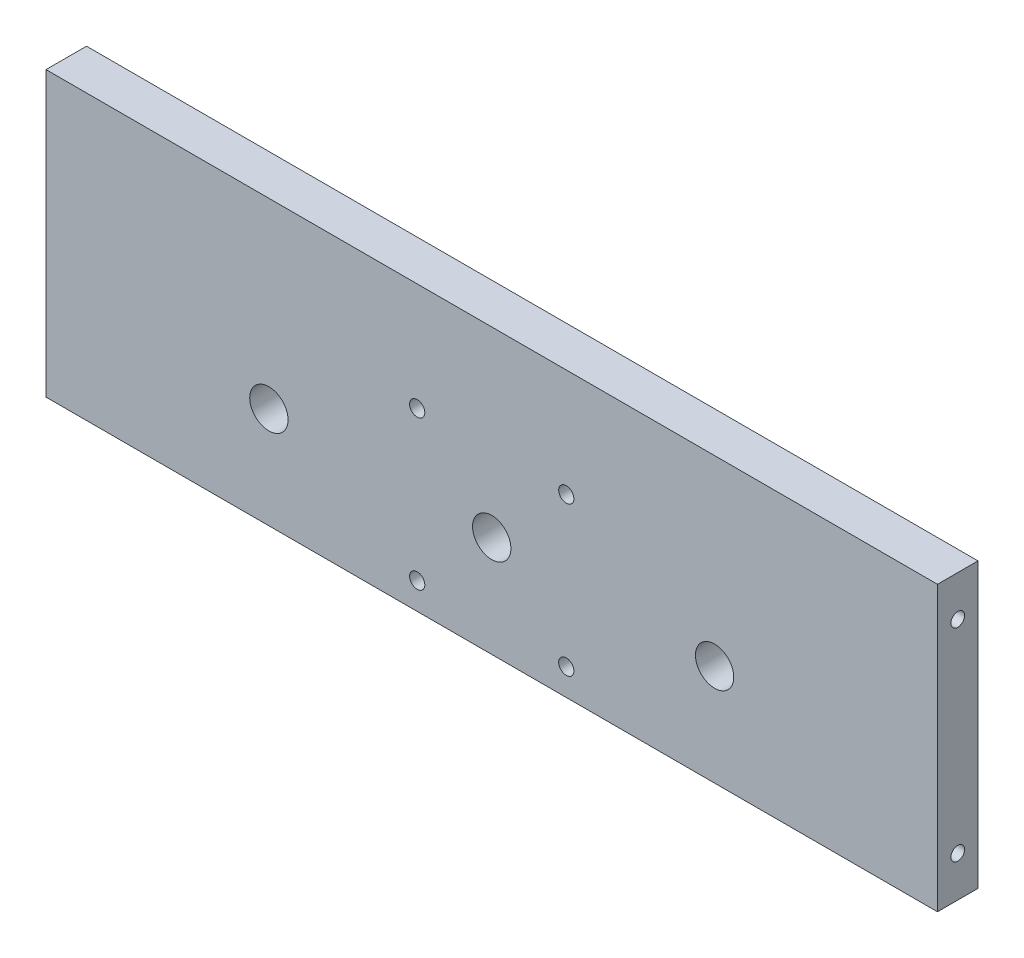
ISO-10303-21;
HEADER;
FILE_DESCRIPTION(('STEP AP214'),'2;1');
FILE_NAME('part.step','',(''),(''),'','','');
FILE_SCHEMA(('AUTOMOTIVE_DESIGN { 1 0 10303 214 1 1 1 1 }'));
ENDSEC;
DATA;
#1=APPLICATION_CONTEXT('core data for automotive mechanical design processes');
#2=APPLICATION_PROTOCOL_DEFINITION('international standard','automotive_design',2000,#1);
#3=PRODUCT_CONTEXT('',#1,'mechanical');
#4=PRODUCT('Part','Part','',(#3));
#5=PRODUCT_RELATED_PRODUCT_CATEGORY('part','',(#4));
#6=PRODUCT_DEFINITION_FORMATION('','',#4);
#7=PRODUCT_DEFINITION_CONTEXT('part definition',#1,'design');
#8=PRODUCT_DEFINITION('design','',#6,#7);
#9=PRODUCT_DEFINITION_SHAPE('','',#8);
#10=(LENGTH_UNIT() NAMED_UNIT(*) SI_UNIT(.MILLI.,.METRE.));
#11=(NAMED_UNIT(*) PLANE_ANGLE_UNIT() SI_UNIT($,.RADIAN.));
#12=(NAMED_UNIT(*) SI_UNIT($,.STERADIAN.) SOLID_ANGLE_UNIT());
#13=UNCERTAINTY_MEASURE_WITH_UNIT(LENGTH_MEASURE(1.E-05),#10,'distance_accuracy_value','');
#14=(GEOMETRIC_REPRESENTATION_CONTEXT(3) GLOBAL_UNCERTAINTY_ASSIGNED_CONTEXT((#13)) GLOBAL_UNIT_ASSIGNED_CONTEXT((#10,
#11,#12)) REPRESENTATION_CONTEXT('',''));
#15=CARTESIAN_POINT('',(0.,0.,0.));
#16=DIRECTION('',(0.,0.,1.));
#17=DIRECTION('',(1.,0.,0.));
#18=AXIS2_PLACEMENT_3D('',#15,#16,#17);
#19=CARTESIAN_POINT('',(0.,88.9,12.7));
#20=DIRECTION('',(0.,0.,-1.));
#21=DIRECTION('',(-1.,0.,0.));
#22=AXIS2_PLACEMENT_3D('',#19,#20,#21);
#23=PLANE('',#22);
#24=CARTESIAN_POINT('',(116.33835,55.11165,12.7));
#25=DIRECTION('',(0.,0.,1.));
#26=DIRECTION('',(1.,0.,0.));
#27=AXIS2_PLACEMENT_3D('',#24,#25,#26);
#28=CIRCLE('',#27,2.38124999999995);
#29=CARTESIAN_POINT('',(118.7196,55.11165,12.7));
#30=VERTEX_POINT('',#29);
#31=EDGE_CURVE('E166',#30,#30,#28,.T.);
#32=ORIENTED_EDGE('',*,*,#31,.F.);
#33=EDGE_LOOP('',(#32));
#34=FACE_BOUND('',#33,.T.);
#35=CARTESIAN_POINT('',(116.33835,8.38834999999998,12.7));
#36=DIRECTION('',(0.,0.,1.));
#37=DIRECTION('',(1.,0.,0.));
#38=AXIS2_PLACEMENT_3D('',#35,#36,#37);
#39=CIRCLE('',#38,2.38124999999995);
#40=CARTESIAN_POINT('',(118.7196,8.38834999999998,12.7));
#41=VERTEX_POINT('',#40);
#42=EDGE_CURVE('E151',#41,#41,#39,.T.);
#43=ORIENTED_EDGE('',*,*,#42,.F.);
#44=EDGE_LOOP('',(#43));
#45=FACE_BOUND('',#44,.T.);
#46=CARTESIAN_POINT('',(69.85,31.75,12.7));
#47=DIRECTION('',(0.,0.,-1.));
#48=DIRECTION('',(-1.,0.,0.));
#49=AXIS2_PLACEMENT_3D('',#46,#47,#48);
#50=CIRCLE('',#49,6.0071);
#51=CARTESIAN_POINT('',(63.8429,31.75,12.7));
#52=VERTEX_POINT('',#51);
#53=EDGE_CURVE('E145',#52,#52,#50,.T.);
#54=ORIENTED_EDGE('',*,*,#53,.T.);
#55=EDGE_LOOP('',(#54));
#56=FACE_BOUND('',#55,.T.);
#57=CARTESIAN_POINT('',(139.7,31.75,12.7));
#58=DIRECTION('',(0.,0.,-1.));
#59=DIRECTION('',(-1.,0.,0.));
#60=AXIS2_PLACEMENT_3D('',#57,#58,#59);
#61=CIRCLE('',#60,6.00709999999998);
#62=CARTESIAN_POINT('',(133.6929,31.75,12.7));
#63=VERTEX_POINT('',#62);
#64=EDGE_CURVE('E139',#63,#63,#61,.T.);
#65=ORIENTED_EDGE('',*,*,#64,.T.);
#66=EDGE_LOOP('',(#65));
#67=FACE_BOUND('',#66,.T.);
#68=CARTESIAN_POINT('',(209.55,31.75,12.7));
#69=DIRECTION('',(0.,0.,-1.));
#70=DIRECTION('',(-1.,0.,0.));
#71=AXIS2_PLACEMENT_3D('',#68,#69,#70);
#72=CIRCLE('',#71,6.00709999999998);
#73=CARTESIAN_POINT('',(203.5429,31.75,12.7));
#74=VERTEX_POINT('',#73);
#75=EDGE_CURVE('E133',#74,#74,#72,.T.);
#76=ORIENTED_EDGE('',*,*,#75,.T.);
#77=EDGE_LOOP('',(#76));
#78=FACE_BOUND('',#77,.T.);
#79=DIRECTION('',(0.,-1.,0.));
#80=VECTOR('',#79,1.);
#81=CARTESIAN_POINT('',(0.,0.,12.7));
#82=LINE('',#81,#80);
#83=CARTESIAN_POINT('',(0.,88.9,12.7));
#84=VERTEX_POINT('',#83);
#85=CARTESIAN_POINT('',(0.,0.,12.7));
#86=VERTEX_POINT('',#85);
#87=EDGE_CURVE('E85',#84,#86,#82,.T.);
#88=ORIENTED_EDGE('',*,*,#87,.T.);
#89=DIRECTION('',(1.,0.,0.));
#90=VECTOR('',#89,1.);
#91=CARTESIAN_POINT('',(0.,0.,12.7));
#92=LINE('',#91,#90);
#93=CARTESIAN_POINT('',(279.4,0.,12.7));
#94=VERTEX_POINT('',#93);
#95=EDGE_CURVE('E80',#86,#94,#92,.T.);
#96=ORIENTED_EDGE('',*,*,#95,.T.);
#97=DIRECTION('',(0.,1.,0.));
#98=VECTOR('',#97,1.);
#99=CARTESIAN_POINT('',(279.4,0.,12.7));
#100=LINE('',#99,#98);
#101=CARTESIAN_POINT('',(279.4,88.9,12.7));
#102=VERTEX_POINT('',#101);
#103=EDGE_CURVE('E83',#94,#102,#100,.T.);
#104=ORIENTED_EDGE('',*,*,#103,.T.);
#105=DIRECTION('',(-1.,0.,0.));
#106=VECTOR('',#105,1.);
#107=CARTESIAN_POINT('',(0.,88.9,12.7));
#108=LINE('',#107,#106);
#109=EDGE_CURVE('E50',#102,#84,#108,.T.);
#110=ORIENTED_EDGE('',*,*,#109,.T.);
#111=EDGE_LOOP('',(#88,#96,#104,#110));
#112=FACE_BOUND('',#111,.T.);
#113=CARTESIAN_POINT('',(163.06165,8.38834999999999,12.7));
#114=DIRECTION('',(0.,0.,1.));
#115=DIRECTION('',(1.,0.,0.));
#116=AXIS2_PLACEMENT_3D('',#113,#114,#115);
#117=CIRCLE('',#116,2.38125);
#118=CARTESIAN_POINT('',(165.4429,8.38834999999999,12.7));
#119=VERTEX_POINT('',#118);
#120=EDGE_CURVE('E160',#119,#119,#117,.T.);
#121=ORIENTED_EDGE('',*,*,#120,.F.);
#122=EDGE_LOOP('',(#121));
#123=FACE_BOUND('',#122,.T.);
#124=CARTESIAN_POINT('',(163.06165,55.11165,12.7));
#125=DIRECTION('',(0.,0.,1.));
#126=DIRECTION('',(1.,0.,0.));
#127=AXIS2_PLACEMENT_3D('',#124,#125,#126);
#128=CIRCLE('',#127,2.38125);
#129=CARTESIAN_POINT('',(165.4429,55.11165,12.7));
#130=VERTEX_POINT('',#129);
#131=EDGE_CURVE('E172',#130,#130,#128,.T.);
#132=ORIENTED_EDGE('',*,*,#131,.F.);
#133=EDGE_LOOP('',(#132));
#134=FACE_BOUND('',#133,.T.);
#135=ADVANCED_FACE('F33',(#34,#45,#56,#67,#78,#112,#123,#134),#23,.F.);
#136=CARTESIAN_POINT('',(0.,88.9,0.));
#137=DIRECTION('',(0.,0.,-1.));
#138=DIRECTION('',(-1.,0.,0.));
#139=AXIS2_PLACEMENT_3D('',#136,#137,#138);
#140=PLANE('',#139);
#141=CARTESIAN_POINT('',(116.33835,55.11165,0.));
#142=DIRECTION('',(0.,0.,1.));
#143=DIRECTION('',(1.,0.,0.));
#144=AXIS2_PLACEMENT_3D('',#141,#142,#143);
#145=CIRCLE('',#144,2.38124999999995);
#146=CARTESIAN_POINT('',(118.7196,55.11165,0.));
#147=VERTEX_POINT('',#146);
#148=EDGE_CURVE('E163',#147,#147,#145,.T.);
#149=ORIENTED_EDGE('',*,*,#148,.T.);
#150=EDGE_LOOP('',(#149));
#151=FACE_BOUND('',#150,.T.);
#152=CARTESIAN_POINT('',(116.33835,8.38834999999998,0.));
#153=DIRECTION('',(0.,0.,1.));
#154=DIRECTION('',(1.,0.,0.));
#155=AXIS2_PLACEMENT_3D('',#152,#153,#154);
#156=CIRCLE('',#155,2.38124999999995);
#157=CARTESIAN_POINT('',(118.7196,8.38834999999998,0.));
#158=VERTEX_POINT('',#157);
#159=EDGE_CURVE('E154',#158,#158,#156,.T.);
#160=ORIENTED_EDGE('',*,*,#159,.T.);
#161=EDGE_LOOP('',(#160));
#162=FACE_BOUND('',#161,.T.);
#163=CARTESIAN_POINT('',(69.85,31.75,0.));
#164=DIRECTION('',(0.,0.,-1.));
#165=DIRECTION('',(-1.,0.,0.));
#166=AXIS2_PLACEMENT_3D('',#163,#164,#165);
#167=CIRCLE('',#166,6.0071);
#168=CARTESIAN_POINT('',(63.8429,31.75,0.));
#169=VERTEX_POINT('',#168);
#170=EDGE_CURVE('E148',#169,#169,#167,.T.);
#171=ORIENTED_EDGE('',*,*,#170,.F.);
#172=EDGE_LOOP('',(#171));
#173=FACE_BOUND('',#172,.T.);
#174=CARTESIAN_POINT('',(139.7,31.75,0.));
#175=DIRECTION('',(0.,0.,-1.));
#176=DIRECTION('',(-1.,0.,0.));
#177=AXIS2_PLACEMENT_3D('',#174,#175,#176);
#178=CIRCLE('',#177,6.00709999999998);
#179=CARTESIAN_POINT('',(133.6929,31.75,0.));
#180=VERTEX_POINT('',#179);
#181=EDGE_CURVE('E142',#180,#180,#178,.T.);
#182=ORIENTED_EDGE('',*,*,#181,.F.);
#183=EDGE_LOOP('',(#182));
#184=FACE_BOUND('',#183,.T.);
#185=CARTESIAN_POINT('',(209.55,31.75,0.));
#186=DIRECTION('',(0.,0.,-1.));
#187=DIRECTION('',(-1.,0.,0.));
#188=AXIS2_PLACEMENT_3D('',#185,#186,#187);
#189=CIRCLE('',#188,6.00709999999998);
#190=CARTESIAN_POINT('',(203.5429,31.75,0.));
#191=VERTEX_POINT('',#190);
#192=EDGE_CURVE('E136',#191,#191,#189,.T.);
#193=ORIENTED_EDGE('',*,*,#192,.F.);
#194=EDGE_LOOP('',(#193));
#195=FACE_BOUND('',#194,.T.);
#196=DIRECTION('',(0.,-1.,0.));
#197=VECTOR('',#196,1.);
#198=CARTESIAN_POINT('',(0.,0.,0.));
#199=LINE('',#198,#197);
#200=CARTESIAN_POINT('',(0.,88.9,0.));
#201=VERTEX_POINT('',#200);
#202=CARTESIAN_POINT('',(0.,0.,0.));
#203=VERTEX_POINT('',#202);
#204=EDGE_CURVE('E97',#201,#203,#199,.T.);
#205=ORIENTED_EDGE('',*,*,#204,.F.);
#206=DIRECTION('',(-1.,0.,0.));
#207=VECTOR('',#206,1.);
#208=CARTESIAN_POINT('',(0.,88.9,0.));
#209=LINE('',#208,#207);
#210=CARTESIAN_POINT('',(279.4,88.9,0.));
#211=VERTEX_POINT('',#210);
#212=EDGE_CURVE('E73',#211,#201,#209,.T.);
#213=ORIENTED_EDGE('',*,*,#212,.F.);
#214=DIRECTION('',(0.,1.,0.));
#215=VECTOR('',#214,1.);
#216=CARTESIAN_POINT('',(279.4,0.,0.));
#217=LINE('',#216,#215);
#218=CARTESIAN_POINT('',(279.4,0.,0.));
#219=VERTEX_POINT('',#218);
#220=EDGE_CURVE('E67',#219,#211,#217,.T.);
#221=ORIENTED_EDGE('',*,*,#220,.F.);
#222=DIRECTION('',(1.,0.,0.));
#223=VECTOR('',#222,1.);
#224=CARTESIAN_POINT('',(0.,0.,0.));
#225=LINE('',#224,#223);
#226=EDGE_CURVE('E89',#203,#219,#225,.T.);
#227=ORIENTED_EDGE('',*,*,#226,.F.);
#228=EDGE_LOOP('',(#205,#213,#221,#227));
#229=FACE_BOUND('',#228,.T.);
#230=CARTESIAN_POINT('',(163.06165,8.38834999999999,0.));
#231=DIRECTION('',(0.,0.,1.));
#232=DIRECTION('',(1.,0.,0.));
#233=AXIS2_PLACEMENT_3D('',#230,#231,#232);
#234=CIRCLE('',#233,2.38125);
#235=CARTESIAN_POINT('',(165.4429,8.38834999999999,0.));
#236=VERTEX_POINT('',#235);
#237=EDGE_CURVE('E157',#236,#236,#234,.T.);
#238=ORIENTED_EDGE('',*,*,#237,.T.);
#239=EDGE_LOOP('',(#238));
#240=FACE_BOUND('',#239,.T.);
#241=CARTESIAN_POINT('',(163.06165,55.11165,0.));
#242=DIRECTION('',(0.,0.,1.));
#243=DIRECTION('',(1.,0.,0.));
#244=AXIS2_PLACEMENT_3D('',#241,#242,#243);
#245=CIRCLE('',#244,2.38125);
#246=CARTESIAN_POINT('',(165.4429,55.11165,0.));
#247=VERTEX_POINT('',#246);
#248=EDGE_CURVE('E169',#247,#247,#245,.T.);
#249=ORIENTED_EDGE('',*,*,#248,.T.);
#250=EDGE_LOOP('',(#249));
#251=FACE_BOUND('',#250,.T.);
#252=ADVANCED_FACE('F108',(#151,#162,#173,#184,#195,#229,#240,#251),#140,.T.);
#253=CARTESIAN_POINT('',(0.,0.,12.7));
#254=DIRECTION('',(1.,0.,0.));
#255=DIRECTION('',(0.,0.,-1.));
#256=AXIS2_PLACEMENT_3D('',#253,#254,#255);
#257=PLANE('',#256);
#258=CARTESIAN_POINT('',(0.,12.7,6.35));
#259=DIRECTION('',(-1.,0.,0.));
#260=DIRECTION('',(0.,0.,1.));
#261=AXIS2_PLACEMENT_3D('',#258,#259,#260);
#262=CIRCLE('',#261,2.1463);
#263=CARTESIAN_POINT('',(0.,12.7,8.4963));
#264=VERTEX_POINT('',#263);
#265=EDGE_CURVE('E130',#264,#264,#262,.T.);
#266=ORIENTED_EDGE('',*,*,#265,.F.);
#267=EDGE_LOOP('',(#266));
#268=FACE_BOUND('',#267,.T.);
#269=CARTESIAN_POINT('',(0.,76.2,6.35));
#270=DIRECTION('',(-1.,0.,0.));
#271=DIRECTION('',(0.,0.,1.));
#272=AXIS2_PLACEMENT_3D('',#269,#270,#271);
#273=CIRCLE('',#272,2.1463);
#274=CARTESIAN_POINT('',(0.,76.2,8.4963));
#275=VERTEX_POINT('',#274);
#276=EDGE_CURVE('E124',#275,#275,#273,.T.);
#277=ORIENTED_EDGE('',*,*,#276,.F.);
#278=EDGE_LOOP('',(#277));
#279=FACE_BOUND('',#278,.T.);
#280=ORIENTED_EDGE('',*,*,#204,.T.);
#281=DIRECTION('',(0.,0.,-1.));
#282=VECTOR('',#281,1.);
#283=CARTESIAN_POINT('',(0.,0.,12.7));
#284=LINE('',#283,#282);
#285=EDGE_CURVE('E11',#86,#203,#284,.T.);
#286=ORIENTED_EDGE('',*,*,#285,.F.);
#287=ORIENTED_EDGE('',*,*,#87,.F.);
#288=DIRECTION('',(0.,0.,-1.));
#289=VECTOR('',#288,1.);
#290=CARTESIAN_POINT('',(0.,88.9,12.7));
#291=LINE('',#290,#289);
#292=EDGE_CURVE('E93',#84,#201,#291,.T.);
#293=ORIENTED_EDGE('',*,*,#292,.T.);
#294=EDGE_LOOP('',(#280,#286,#287,#293));
#295=FACE_BOUND('',#294,.T.);
#296=ADVANCED_FACE('F35',(#268,#279,#295),#257,.F.);
#297=CARTESIAN_POINT('',(0.,0.,12.7));
#298=DIRECTION('',(0.,1.,0.));
#299=DIRECTION('',(0.,0.,1.));
#300=AXIS2_PLACEMENT_3D('',#297,#298,#299);
#301=PLANE('',#300);
#302=ORIENTED_EDGE('',*,*,#226,.T.);
#303=DIRECTION('',(0.,0.,-1.));
#304=VECTOR('',#303,1.);
#305=CARTESIAN_POINT('',(279.4,0.,12.7));
#306=LINE('',#305,#304);
#307=EDGE_CURVE('E42',#94,#219,#306,.T.);
#308=ORIENTED_EDGE('',*,*,#307,.F.);
#309=ORIENTED_EDGE('',*,*,#95,.F.);
#310=ORIENTED_EDGE('',*,*,#285,.T.);
#311=EDGE_LOOP('',(#302,#308,#309,#310));
#312=FACE_BOUND('',#311,.T.);
#313=ADVANCED_FACE('F88',(#312),#301,.F.);
#314=CARTESIAN_POINT('',(279.4,0.,12.7));
#315=DIRECTION('',(-1.,0.,0.));
#316=DIRECTION('',(0.,0.,1.));
#317=AXIS2_PLACEMENT_3D('',#314,#315,#316);
#318=PLANE('',#317);
#319=CARTESIAN_POINT('',(279.4,12.7,6.35));
#320=DIRECTION('',(1.,0.,0.));
#321=DIRECTION('',(0.,0.,-1.));
#322=AXIS2_PLACEMENT_3D('',#319,#320,#321);
#323=CIRCLE('',#322,2.1463);
#324=CARTESIAN_POINT('',(279.4,12.7,4.2037));
#325=VERTEX_POINT('',#324);
#326=EDGE_CURVE('E118',#325,#325,#323,.T.);
#327=ORIENTED_EDGE('',*,*,#326,.F.);
#328=EDGE_LOOP('',(#327));
#329=FACE_BOUND('',#328,.T.);
#330=CARTESIAN_POINT('',(279.4,76.2,6.35));
#331=DIRECTION('',(1.,0.,0.));
#332=DIRECTION('',(0.,0.,-1.));
#333=AXIS2_PLACEMENT_3D('',#330,#331,#332);
#334=CIRCLE('',#333,2.1463);
#335=CARTESIAN_POINT('',(279.4,76.2,4.2037));
#336=VERTEX_POINT('',#335);
#337=EDGE_CURVE('E112',#336,#336,#334,.T.);
#338=ORIENTED_EDGE('',*,*,#337,.F.);
#339=EDGE_LOOP('',(#338));
#340=FACE_BOUND('',#339,.T.);
#341=ORIENTED_EDGE('',*,*,#220,.T.);
#342=DIRECTION('',(0.,0.,-1.));
#343=VECTOR('',#342,1.);
#344=CARTESIAN_POINT('',(279.4,88.9,12.7));
#345=LINE('',#344,#343);
#346=EDGE_CURVE('E90',#102,#211,#345,.T.);
#347=ORIENTED_EDGE('',*,*,#346,.F.);
#348=ORIENTED_EDGE('',*,*,#103,.F.);
#349=ORIENTED_EDGE('',*,*,#307,.T.);
#350=EDGE_LOOP('',(#341,#347,#348,#349));
#351=FACE_BOUND('',#350,.T.);
#352=ADVANCED_FACE('F91',(#329,#340,#351),#318,.F.);
#353=CARTESIAN_POINT('',(0.,88.9,12.7));
#354=DIRECTION('',(0.,-1.,0.));
#355=DIRECTION('',(0.,0.,-1.));
#356=AXIS2_PLACEMENT_3D('',#353,#354,#355);
#357=PLANE('',#356);
#358=ORIENTED_EDGE('',*,*,#212,.T.);
#359=ORIENTED_EDGE('',*,*,#292,.F.);
#360=ORIENTED_EDGE('',*,*,#109,.F.);
#361=ORIENTED_EDGE('',*,*,#346,.T.);
#362=EDGE_LOOP('',(#358,#359,#360,#361));
#363=FACE_BOUND('',#362,.T.);
#364=ADVANCED_FACE('F105',(#363),#357,.F.);
#365=CARTESIAN_POINT('',(241.3,76.2,6.35));
#366=DIRECTION('',(1.,0.,0.));
#367=DIRECTION('',(0.,0.,-1.));
#368=AXIS2_PLACEMENT_3D('',#365,#366,#367);
#369=CYLINDRICAL_SURFACE('',#368,2.1463);
#370=CARTESIAN_POINT('',(241.3,76.2,6.35));
#371=DIRECTION('',(1.,0.,0.));
#372=DIRECTION('',(0.,0.,-1.));
#373=AXIS2_PLACEMENT_3D('',#370,#371,#372);
#374=CIRCLE('',#373,2.1463);
#375=CARTESIAN_POINT('',(241.3,76.2,4.2037));
#376=VERTEX_POINT('',#375);
#377=EDGE_CURVE('E100',#376,#376,#374,.T.);
#378=CARTESIAN_POINT('',(241.3,76.2,4.2037));
#379=CARTESIAN_POINT('',(241.696875,76.2,4.2037));
#380=CARTESIAN_POINT('',(242.09375,76.2,4.2037));
#381=CARTESIAN_POINT('',(242.8875,76.2,4.2037));
#382=CARTESIAN_POINT('',(243.284375,76.2,4.2037));
#383=CARTESIAN_POINT('',(244.078125,76.2,4.2037));
#384=CARTESIAN_POINT('',(244.475,76.2,4.2037));
#385=CARTESIAN_POINT('',(245.26875,76.2,4.2037));
#386=CARTESIAN_POINT('',(245.665625,76.2,4.2037));
#387=CARTESIAN_POINT('',(246.459375,76.2,4.2037));
#388=CARTESIAN_POINT('',(246.85625,76.2,4.2037));
#389=CARTESIAN_POINT('',(247.65,76.2,4.2037));
#390=CARTESIAN_POINT('',(248.046875,76.2,4.2037));
#391=CARTESIAN_POINT('',(248.840625,76.2,4.2037));
#392=CARTESIAN_POINT('',(249.2375,76.2,4.2037));
#393=CARTESIAN_POINT('',(250.03125,76.2,4.2037));
#394=CARTESIAN_POINT('',(250.428125,76.2,4.2037));
#395=CARTESIAN_POINT('',(251.221875,76.2,4.2037));
#396=CARTESIAN_POINT('',(251.61875,76.2,4.2037));
#397=CARTESIAN_POINT('',(252.4125,76.2,4.2037));
#398=CARTESIAN_POINT('',(252.809375,76.2,4.2037));
#399=CARTESIAN_POINT('',(253.603125,76.2,4.2037));
#400=CARTESIAN_POINT('',(254.,76.2,4.2037));
#401=CARTESIAN_POINT('',(254.79375,76.2,4.2037));
#402=CARTESIAN_POINT('',(255.190625,76.2,4.2037));
#403=CARTESIAN_POINT('',(255.984375,76.2,4.2037));
#404=CARTESIAN_POINT('',(256.38125,76.2,4.2037));
#405=CARTESIAN_POINT('',(257.175,76.2,4.2037));
#406=CARTESIAN_POINT('',(257.571875,76.2,4.2037));
#407=CARTESIAN_POINT('',(258.365625,76.2,4.2037));
#408=CARTESIAN_POINT('',(258.7625,76.2,4.2037));
#409=CARTESIAN_POINT('',(259.55625,76.2,4.2037));
#410=CARTESIAN_POINT('',(259.953125,76.2,4.2037));
#411=CARTESIAN_POINT('',(260.746875,76.2,4.2037));
#412=CARTESIAN_POINT('',(261.14375,76.2,4.2037));
#413=CARTESIAN_POINT('',(261.9375,76.2,4.2037));
#414=CARTESIAN_POINT('',(262.334375,76.2,4.2037));
#415=CARTESIAN_POINT('',(263.128125,76.2,4.2037));
#416=CARTESIAN_POINT('',(263.525,76.2,4.2037));
#417=CARTESIAN_POINT('',(264.31875,76.2,4.2037));
#418=CARTESIAN_POINT('',(264.715625,76.2,4.2037));
#419=CARTESIAN_POINT('',(265.509375,76.2,4.2037));
#420=CARTESIAN_POINT('',(265.90625,76.2,4.2037));
#421=CARTESIAN_POINT('',(266.7,76.2,4.2037));
#422=CARTESIAN_POINT('',(267.096875,76.2,4.2037));
#423=CARTESIAN_POINT('',(267.890625,76.2,4.2037));
#424=CARTESIAN_POINT('',(268.2875,76.2,4.2037));
#425=CARTESIAN_POINT('',(269.08125,76.2,4.2037));
#426=CARTESIAN_POINT('',(269.478125,76.2,4.2037));
#427=CARTESIAN_POINT('',(270.271875,76.2,4.2037));
#428=CARTESIAN_POINT('',(270.66875,76.2,4.2037));
#429=CARTESIAN_POINT('',(271.4625,76.2,4.2037));
#430=CARTESIAN_POINT('',(271.859375,76.2,4.2037));
#431=CARTESIAN_POINT('',(272.653125,76.2,4.2037));
#432=CARTESIAN_POINT('',(273.05,76.2,4.2037));
#433=CARTESIAN_POINT('',(273.84375,76.2,4.2037));
#434=CARTESIAN_POINT('',(274.240625,76.2,4.2037));
#435=CARTESIAN_POINT('',(275.034375,76.2,4.2037));
#436=CARTESIAN_POINT('',(275.43125,76.2,4.2037));
#437=CARTESIAN_POINT('',(276.225,76.2,4.2037));
#438=CARTESIAN_POINT('',(276.621875,76.2,4.2037));
#439=CARTESIAN_POINT('',(277.415625,76.2,4.2037));
#440=CARTESIAN_POINT('',(277.8125,76.2,4.2037));
#441=CARTESIAN_POINT('',(278.60625,76.2,4.2037));
#442=CARTESIAN_POINT('',(279.003125,76.2,4.2037));
#443=CARTESIAN_POINT('',(279.4,76.2,4.2037));
#444=B_SPLINE_CURVE_WITH_KNOTS('',3,(#378,#379,#380,#381,#382,#383,#384,#385,#386,#387,#388,
#389,#390,#391,#392,#393,#394,#395,#396,#397,#398,#399,#400,#401,#402,#403,#404,#405,#406,#407,
#408,#409,#410,#411,#412,#413,#414,#415,#416,#417,#418,#419,#420,#421,#422,#423,#424,#425,#426,
#427,#428,#429,#430,#431,#432,#433,#434,#435,#436,#437,#438,#439,#440,#441,#442,#443),
.UNSPECIFIED.,.F.,.F.,(4,2,2,2,2,2,2,2,2,2,2,2,2,2,2,2,2,2,2,2,2,2,2,2,2,2,2,2,2,2,2,2,4),(0.,
1.190625,2.38125,3.571875,4.7625,5.953125,7.14375,8.334375,9.52500000000001,10.715625,11.90625,
13.096875,14.2875,15.478125,16.66875,17.859375,19.05,20.240625,21.43125,22.621875,23.8125,
25.003125,26.19375,27.384375,28.575,29.765625,30.95625,32.146875,33.3375,34.528125,35.71875,
36.909375,38.1),.UNSPECIFIED.);
#445=EDGE_CURVE('BSEAM202',#376,#336,#444,.T.);
#446=ORIENTED_EDGE('',*,*,#377,.F.);
#447=ORIENTED_EDGE('',*,*,#337,.T.);
#448=ORIENTED_EDGE('',*,*,#445,.T.);
#449=ORIENTED_EDGE('',*,*,#445,.F.);
#450=EDGE_LOOP('',(#446,#448,#447,#449));
#451=FACE_BOUND('',#450,.T.);
#452=ADVANCED_FACE('F202',(#451),#369,.F.);
#453=CARTESIAN_POINT('',(241.3,76.2,6.35));
#454=DIRECTION('',(1.,0.,0.));
#455=DIRECTION('',(0.,0.,-1.));
#456=AXIS2_PLACEMENT_3D('',#453,#454,#455);
#457=PLANE('',#456);
#458=ORIENTED_EDGE('',*,*,#377,.T.);
#459=EDGE_LOOP('',(#458));
#460=FACE_BOUND('',#459,.T.);
#461=ADVANCED_FACE('F240',(#460),#457,.T.);
#462=CARTESIAN_POINT('',(241.3,12.7,6.35));
#463=DIRECTION('',(1.,0.,0.));
#464=DIRECTION('',(0.,0.,-1.));
#465=AXIS2_PLACEMENT_3D('',#462,#463,#464);
#466=CYLINDRICAL_SURFACE('',#465,2.1463);
#467=CARTESIAN_POINT('',(241.3,12.7,6.35));
#468=DIRECTION('',(1.,0.,0.));
#469=DIRECTION('',(0.,0.,-1.));
#470=AXIS2_PLACEMENT_3D('',#467,#468,#469);
#471=CIRCLE('',#470,2.1463);
#472=CARTESIAN_POINT('',(241.3,12.7,4.2037));
#473=VERTEX_POINT('',#472);
#474=EDGE_CURVE('E115',#473,#473,#471,.T.);
#475=CARTESIAN_POINT('',(241.3,12.7,4.2037));
#476=CARTESIAN_POINT('',(241.696875,12.7,4.2037));
#477=CARTESIAN_POINT('',(242.09375,12.7,4.2037));
#478=CARTESIAN_POINT('',(242.8875,12.7,4.2037));
#479=CARTESIAN_POINT('',(243.284375,12.7,4.2037));
#480=CARTESIAN_POINT('',(244.078125,12.7,4.2037));
#481=CARTESIAN_POINT('',(244.475,12.7,4.2037));
#482=CARTESIAN_POINT('',(245.26875,12.7,4.2037));
#483=CARTESIAN_POINT('',(245.665625,12.7,4.2037));
#484=CARTESIAN_POINT('',(246.459375,12.7,4.2037));
#485=CARTESIAN_POINT('',(246.85625,12.7,4.2037));
#486=CARTESIAN_POINT('',(247.65,12.7,4.2037));
#487=CARTESIAN_POINT('',(248.046875,12.7,4.2037));
#488=CARTESIAN_POINT('',(248.840625,12.7,4.2037));
#489=CARTESIAN_POINT('',(249.2375,12.7,4.2037));
#490=CARTESIAN_POINT('',(250.03125,12.7,4.2037));
#491=CARTESIAN_POINT('',(250.428125,12.7,4.2037));
#492=CARTESIAN_POINT('',(251.221875,12.7,4.2037));
#493=CARTESIAN_POINT('',(251.61875,12.7,4.2037));
#494=CARTESIAN_POINT('',(252.4125,12.7,4.2037));
#495=CARTESIAN_POINT('',(252.809375,12.7,4.2037));
#496=CARTESIAN_POINT('',(253.603125,12.7,4.2037));
#497=CARTESIAN_POINT('',(254.,12.7,4.2037));
#498=CARTESIAN_POINT('',(254.79375,12.7,4.2037));
#499=CARTESIAN_POINT('',(255.190625,12.7,4.2037));
#500=CARTESIAN_POINT('',(255.984375,12.7,4.2037));
#501=CARTESIAN_POINT('',(256.38125,12.7,4.2037));
#502=CARTESIAN_POINT('',(257.175,12.7,4.2037));
#503=CARTESIAN_POINT('',(257.571875,12.7,4.2037));
#504=CARTESIAN_POINT('',(258.365625,12.7,4.2037));
#505=CARTESIAN_POINT('',(258.7625,12.7,4.2037));
#506=CARTESIAN_POINT('',(259.55625,12.7,4.2037));
#507=CARTESIAN_POINT('',(259.953125,12.7,4.2037));
#508=CARTESIAN_POINT('',(260.746875,12.7,4.2037));
#509=CARTESIAN_POINT('',(261.14375,12.7,4.2037));
#510=CARTESIAN_POINT('',(261.9375,12.7,4.2037));
#511=CARTESIAN_POINT('',(262.334375,12.7,4.2037));
#512=CARTESIAN_POINT('',(263.128125,12.7,4.2037));
#513=CARTESIAN_POINT('',(263.525,12.7,4.2037));
#514=CARTESIAN_POINT('',(264.31875,12.7,4.2037));
#515=CARTESIAN_POINT('',(264.715625,12.7,4.2037));
#516=CARTESIAN_POINT('',(265.509375,12.7,4.2037));
#517=CARTESIAN_POINT('',(265.90625,12.7,4.2037));
#518=CARTESIAN_POINT('',(266.7,12.7,4.2037));
#519=CARTESIAN_POINT('',(267.096875,12.7,4.2037));
#520=CARTESIAN_POINT('',(267.890625,12.7,4.2037));
#521=CARTESIAN_POINT('',(268.2875,12.7,4.2037));
#522=CARTESIAN_POINT('',(269.08125,12.7,4.2037));
#523=CARTESIAN_POINT('',(269.478125,12.7,4.2037));
#524=CARTESIAN_POINT('',(270.271875,12.7,4.2037));
#525=CARTESIAN_POINT('',(270.66875,12.7,4.2037));
#526=CARTESIAN_POINT('',(271.4625,12.7,4.2037));
#527=CARTESIAN_POINT('',(271.859375,12.7,4.2037));
#528=CARTESIAN_POINT('',(272.653125,12.7,4.2037));
#529=CARTESIAN_POINT('',(273.05,12.7,4.2037));
#530=CARTESIAN_POINT('',(273.84375,12.7,4.2037));
#531=CARTESIAN_POINT('',(274.240625,12.7,4.2037));
#532=CARTESIAN_POINT('',(275.034375,12.7,4.2037));
#533=CARTESIAN_POINT('',(275.43125,12.7,4.2037));
#534=CARTESIAN_POINT('',(276.225,12.7,4.2037));
#535=CARTESIAN_POINT('',(276.621875,12.7,4.2037));
#536=CARTESIAN_POINT('',(277.415625,12.7,4.2037));
#537=CARTESIAN_POINT('',(277.8125,12.7,4.2037));
#538=CARTESIAN_POINT('',(278.60625,12.7,4.2037));
#539=CARTESIAN_POINT('',(279.003125,12.7,4.2037));
#540=CARTESIAN_POINT('',(279.4,12.7,4.2037));
#541=B_SPLINE_CURVE_WITH_KNOTS('',3,(#475,#476,#477,#478,#479,#480,#481,#482,#483,#484,#485,
#486,#487,#488,#489,#490,#491,#492,#493,#494,#495,#496,#497,#498,#499,#500,#501,#502,#503,#504,
#505,#506,#507,#508,#509,#510,#511,#512,#513,#514,#515,#516,#517,#518,#519,#520,#521,#522,#523,
#524,#525,#526,#527,#528,#529,#530,#531,#532,#533,#534,#535,#536,#537,#538,#539,#540),
.UNSPECIFIED.,.F.,.F.,(4,2,2,2,2,2,2,2,2,2,2,2,2,2,2,2,2,2,2,2,2,2,2,2,2,2,2,2,2,2,2,2,4),(0.,
1.190625,2.38125,3.571875,4.7625,5.953125,7.14375,8.334375,9.52500000000001,10.715625,11.90625,
13.096875,14.2875,15.478125,16.66875,17.859375,19.05,20.240625,21.43125,22.621875,23.8125,
25.003125,26.19375,27.384375,28.575,29.765625,30.95625,32.146875,33.3375,34.528125,35.71875,
36.909375,38.1),.UNSPECIFIED.);
#542=EDGE_CURVE('BSEAM233',#473,#325,#541,.T.);
#543=ORIENTED_EDGE('',*,*,#474,.F.);
#544=ORIENTED_EDGE('',*,*,#326,.T.);
#545=ORIENTED_EDGE('',*,*,#542,.T.);
#546=ORIENTED_EDGE('',*,*,#542,.F.);
#547=EDGE_LOOP('',(#543,#545,#544,#546));
#548=FACE_BOUND('',#547,.T.);
#549=ADVANCED_FACE('F233',(#548),#466,.F.);
#550=CARTESIAN_POINT('',(241.3,12.7,6.35));
#551=DIRECTION('',(1.,0.,0.));
#552=DIRECTION('',(0.,0.,-1.));
#553=AXIS2_PLACEMENT_3D('',#550,#551,#552);
#554=PLANE('',#553);
#555=ORIENTED_EDGE('',*,*,#474,.T.);
#556=EDGE_LOOP('',(#555));
#557=FACE_BOUND('',#556,.T.);
#558=ADVANCED_FACE('F223',(#557),#554,.T.);
#559=CARTESIAN_POINT('',(38.1,76.2,6.35));
#560=DIRECTION('',(-1.,0.,0.));
#561=DIRECTION('',(0.,0.,1.));
#562=AXIS2_PLACEMENT_3D('',#559,#560,#561);
#563=CYLINDRICAL_SURFACE('',#562,2.1463);
#564=CARTESIAN_POINT('',(38.1,76.2,6.35));
#565=DIRECTION('',(-1.,0.,0.));
#566=DIRECTION('',(0.,0.,1.));
#567=AXIS2_PLACEMENT_3D('',#564,#565,#566);
#568=CIRCLE('',#567,2.1463);
#569=CARTESIAN_POINT('',(38.1,76.2,8.4963));
#570=VERTEX_POINT('',#569);
#571=EDGE_CURVE('E121',#570,#570,#568,.T.);
#572=CARTESIAN_POINT('',(38.1,76.2,8.4963));
#573=CARTESIAN_POINT('',(37.703125,76.2,8.4963));
#574=CARTESIAN_POINT('',(37.30625,76.2,8.4963));
#575=CARTESIAN_POINT('',(36.5125,76.2,8.4963));
#576=CARTESIAN_POINT('',(36.115625,76.2,8.4963));
#577=CARTESIAN_POINT('',(35.321875,76.2,8.4963));
#578=CARTESIAN_POINT('',(34.925,76.2,8.4963));
#579=CARTESIAN_POINT('',(34.13125,76.2,8.4963));
#580=CARTESIAN_POINT('',(33.734375,76.2,8.4963));
#581=CARTESIAN_POINT('',(32.940625,76.2,8.4963));
#582=CARTESIAN_POINT('',(32.54375,76.2,8.4963));
#583=CARTESIAN_POINT('',(31.75,76.2,8.4963));
#584=CARTESIAN_POINT('',(31.353125,76.2,8.4963));
#585=CARTESIAN_POINT('',(30.559375,76.2,8.4963));
#586=CARTESIAN_POINT('',(30.1625,76.2,8.4963));
#587=CARTESIAN_POINT('',(29.36875,76.2,8.4963));
#588=CARTESIAN_POINT('',(28.971875,76.2,8.4963));
#589=CARTESIAN_POINT('',(28.178125,76.2,8.4963));
#590=CARTESIAN_POINT('',(27.78125,76.2,8.4963));
#591=CARTESIAN_POINT('',(26.9875,76.2,8.4963));
#592=CARTESIAN_POINT('',(26.590625,76.2,8.4963));
#593=CARTESIAN_POINT('',(25.796875,76.2,8.4963));
#594=CARTESIAN_POINT('',(25.4,76.2,8.4963));
#595=CARTESIAN_POINT('',(24.60625,76.2,8.4963));
#596=CARTESIAN_POINT('',(24.209375,76.2,8.4963));
#597=CARTESIAN_POINT('',(23.415625,76.2,8.4963));
#598=CARTESIAN_POINT('',(23.01875,76.2,8.4963));
#599=CARTESIAN_POINT('',(22.225,76.2,8.4963));
#600=CARTESIAN_POINT('',(21.828125,76.2,8.4963));
#601=CARTESIAN_POINT('',(21.034375,76.2,8.4963));
#602=CARTESIAN_POINT('',(20.6375,76.2,8.4963));
#603=CARTESIAN_POINT('',(19.84375,76.2,8.4963));
#604=CARTESIAN_POINT('',(19.446875,76.2,8.4963));
#605=CARTESIAN_POINT('',(18.653125,76.2,8.4963));
#606=CARTESIAN_POINT('',(18.25625,76.2,8.4963));
#607=CARTESIAN_POINT('',(17.4625,76.2,8.4963));
#608=CARTESIAN_POINT('',(17.065625,76.2,8.4963));
#609=CARTESIAN_POINT('',(16.271875,76.2,8.4963));
#610=CARTESIAN_POINT('',(15.875,76.2,8.4963));
#611=CARTESIAN_POINT('',(15.08125,76.2,8.4963));
#612=CARTESIAN_POINT('',(14.684375,76.2,8.4963));
#613=CARTESIAN_POINT('',(13.890625,76.2,8.4963));
#614=CARTESIAN_POINT('',(13.49375,76.2,8.4963));
#615=CARTESIAN_POINT('',(12.7,76.2,8.4963));
#616=CARTESIAN_POINT('',(12.303125,76.2,8.4963));
#617=CARTESIAN_POINT('',(11.509375,76.2,8.4963));
#618=CARTESIAN_POINT('',(11.1125,76.2,8.4963));
#619=CARTESIAN_POINT('',(10.31875,76.2,8.4963));
#620=CARTESIAN_POINT('',(9.921875,76.2,8.4963));
#621=CARTESIAN_POINT('',(9.128125,76.2,8.4963));
#622=CARTESIAN_POINT('',(8.73125,76.2,8.4963));
#623=CARTESIAN_POINT('',(7.9375,76.2,8.4963));
#624=CARTESIAN_POINT('',(7.540625,76.2,8.4963));
#625=CARTESIAN_POINT('',(6.746875,76.2,8.4963));
#626=CARTESIAN_POINT('',(6.35,76.2,8.4963));
#627=CARTESIAN_POINT('',(5.55625,76.2,8.4963));
#628=CARTESIAN_POINT('',(5.159375,76.2,8.4963));
#629=CARTESIAN_POINT('',(4.365625,76.2,8.4963));
#630=CARTESIAN_POINT('',(3.96875,76.2,8.4963));
#631=CARTESIAN_POINT('',(3.175,76.2,8.4963));
#632=CARTESIAN_POINT('',(2.778125,76.2,8.4963));
#633=CARTESIAN_POINT('',(1.984375,76.2,8.4963));
#634=CARTESIAN_POINT('',(1.5875,76.2,8.4963));
#635=CARTESIAN_POINT('',(0.79375,76.2,8.4963));
#636=CARTESIAN_POINT('',(0.396875,76.2,8.4963));
#637=CARTESIAN_POINT('',(0.,76.2,8.4963));
#638=B_SPLINE_CURVE_WITH_KNOTS('',3,(#572,#573,#574,#575,#576,#577,#578,#579,#580,#581,#582,
#583,#584,#585,#586,#587,#588,#589,#590,#591,#592,#593,#594,#595,#596,#597,#598,#599,#600,#601,
#602,#603,#604,#605,#606,#607,#608,#609,#610,#611,#612,#613,#614,#615,#616,#617,#618,#619,#620,
#621,#622,#623,#624,#625,#626,#627,#628,#629,#630,#631,#632,#633,#634,#635,#636,#637),
.UNSPECIFIED.,.F.,.F.,(4,2,2,2,2,2,2,2,2,2,2,2,2,2,2,2,2,2,2,2,2,2,2,2,2,2,2,2,2,2,2,2,4),(0.,
1.19062499999999,2.38124999999999,3.571875,4.7625,5.953125,7.14375,8.334375,9.525,10.715625,
11.90625,13.096875,14.2875,15.478125,16.66875,17.859375,19.05,20.240625,21.43125,22.621875,
23.8125,25.003125,26.19375,27.384375,28.575,29.765625,30.95625,32.146875,33.3375,34.528125,
35.71875,36.909375,38.1),.UNSPECIFIED.);
#639=EDGE_CURVE('BSEAM220',#570,#275,#638,.T.);
#640=ORIENTED_EDGE('',*,*,#571,.F.);
#641=ORIENTED_EDGE('',*,*,#276,.T.);
#642=ORIENTED_EDGE('',*,*,#639,.T.);
#643=ORIENTED_EDGE('',*,*,#639,.F.);
#644=EDGE_LOOP('',(#640,#642,#641,#643));
#645=FACE_BOUND('',#644,.T.);
#646=ADVANCED_FACE('F220',(#645),#563,.F.);
#647=CARTESIAN_POINT('',(38.1,76.2,6.35));
#648=DIRECTION('',(-1.,0.,0.));
#649=DIRECTION('',(0.,0.,1.));
#650=AXIS2_PLACEMENT_3D('',#647,#648,#649);
#651=PLANE('',#650);
#652=ORIENTED_EDGE('',*,*,#571,.T.);
#653=EDGE_LOOP('',(#652));
#654=FACE_BOUND('',#653,.T.);
#655=ADVANCED_FACE('F222',(#654),#651,.T.);
#656=CARTESIAN_POINT('',(38.1,12.7,6.35));
#657=DIRECTION('',(-1.,0.,0.));
#658=DIRECTION('',(0.,0.,1.));
#659=AXIS2_PLACEMENT_3D('',#656,#657,#658);
#660=CYLINDRICAL_SURFACE('',#659,2.1463);
#661=CARTESIAN_POINT('',(38.1,12.7,6.35));
#662=DIRECTION('',(-1.,0.,0.));
#663=DIRECTION('',(0.,0.,1.));
#664=AXIS2_PLACEMENT_3D('',#661,#662,#663);
#665=CIRCLE('',#664,2.1463);
#666=CARTESIAN_POINT('',(38.1,12.7,8.4963));
#667=VERTEX_POINT('',#666);
#668=EDGE_CURVE('E127',#667,#667,#665,.T.);
#669=CARTESIAN_POINT('',(38.1,12.7,8.4963));
#670=CARTESIAN_POINT('',(37.703125,12.7,8.4963));
#671=CARTESIAN_POINT('',(37.30625,12.7,8.4963));
#672=CARTESIAN_POINT('',(36.5125,12.7,8.4963));
#673=CARTESIAN_POINT('',(36.115625,12.7,8.4963));
#674=CARTESIAN_POINT('',(35.321875,12.7,8.4963));
#675=CARTESIAN_POINT('',(34.925,12.7,8.4963));
#676=CARTESIAN_POINT('',(34.13125,12.7,8.4963));
#677=CARTESIAN_POINT('',(33.734375,12.7,8.4963));
#678=CARTESIAN_POINT('',(32.940625,12.7,8.4963));
#679=CARTESIAN_POINT('',(32.54375,12.7,8.4963));
#680=CARTESIAN_POINT('',(31.75,12.7,8.4963));
#681=CARTESIAN_POINT('',(31.353125,12.7,8.4963));
#682=CARTESIAN_POINT('',(30.559375,12.7,8.4963));
#683=CARTESIAN_POINT('',(30.1625,12.7,8.4963));
#684=CARTESIAN_POINT('',(29.36875,12.7,8.4963));
#685=CARTESIAN_POINT('',(28.971875,12.7,8.4963));
#686=CARTESIAN_POINT('',(28.178125,12.7,8.4963));
#687=CARTESIAN_POINT('',(27.78125,12.7,8.4963));
#688=CARTESIAN_POINT('',(26.9875,12.7,8.4963));
#689=CARTESIAN_POINT('',(26.590625,12.7,8.4963));
#690=CARTESIAN_POINT('',(25.796875,12.7,8.4963));
#691=CARTESIAN_POINT('',(25.4,12.7,8.4963));
#692=CARTESIAN_POINT('',(24.60625,12.7,8.4963));
#693=CARTESIAN_POINT('',(24.209375,12.7,8.4963));
#694=CARTESIAN_POINT('',(23.415625,12.7,8.4963));
#695=CARTESIAN_POINT('',(23.01875,12.7,8.4963));
#696=CARTESIAN_POINT('',(22.225,12.7,8.4963));
#697=CARTESIAN_POINT('',(21.828125,12.7,8.4963));
#698=CARTESIAN_POINT('',(21.034375,12.7,8.4963));
#699=CARTESIAN_POINT('',(20.6375,12.7,8.4963));
#700=CARTESIAN_POINT('',(19.84375,12.7,8.4963));
#701=CARTESIAN_POINT('',(19.446875,12.7,8.4963));
#702=CARTESIAN_POINT('',(18.653125,12.7,8.4963));
#703=CARTESIAN_POINT('',(18.25625,12.7,8.4963));
#704=CARTESIAN_POINT('',(17.4625,12.7,8.4963));
#705=CARTESIAN_POINT('',(17.065625,12.7,8.4963));
#706=CARTESIAN_POINT('',(16.271875,12.7,8.4963));
#707=CARTESIAN_POINT('',(15.875,12.7,8.4963));
#708=CARTESIAN_POINT('',(15.08125,12.7,8.4963));
#709=CARTESIAN_POINT('',(14.684375,12.7,8.4963));
#710=CARTESIAN_POINT('',(13.890625,12.7,8.4963));
#711=CARTESIAN_POINT('',(13.49375,12.7,8.4963));
#712=CARTESIAN_POINT('',(12.7,12.7,8.4963));
#713=CARTESIAN_POINT('',(12.303125,12.7,8.4963));
#714=CARTESIAN_POINT('',(11.509375,12.7,8.4963));
#715=CARTESIAN_POINT('',(11.1125,12.7,8.4963));
#716=CARTESIAN_POINT('',(10.31875,12.7,8.4963));
#717=CARTESIAN_POINT('',(9.921875,12.7,8.4963));
#718=CARTESIAN_POINT('',(9.128125,12.7,8.4963));
#719=CARTESIAN_POINT('',(8.73125,12.7,8.4963));
#720=CARTESIAN_POINT('',(7.9375,12.7,8.4963));
#721=CARTESIAN_POINT('',(7.540625,12.7,8.4963));
#722=CARTESIAN_POINT('',(6.746875,12.7,8.4963));
#723=CARTESIAN_POINT('',(6.35,12.7,8.4963));
#724=CARTESIAN_POINT('',(5.55625,12.7,8.4963));
#725=CARTESIAN_POINT('',(5.159375,12.7,8.4963));
#726=CARTESIAN_POINT('',(4.365625,12.7,8.4963));
#727=CARTESIAN_POINT('',(3.96875,12.7,8.4963));
#728=CARTESIAN_POINT('',(3.175,12.7,8.4963));
#729=CARTESIAN_POINT('',(2.778125,12.7,8.4963));
#730=CARTESIAN_POINT('',(1.984375,12.7,8.4963));
#731=CARTESIAN_POINT('',(1.5875,12.7,8.4963));
#732=CARTESIAN_POINT('',(0.79375,12.7,8.4963));
#733=CARTESIAN_POINT('',(0.396875,12.7,8.4963));
#734=CARTESIAN_POINT('',(0.,12.7,8.4963));
#735=B_SPLINE_CURVE_WITH_KNOTS('',3,(#669,#670,#671,#672,#673,#674,#675,#676,#677,#678,#679,
#680,#681,#682,#683,#684,#685,#686,#687,#688,#689,#690,#691,#692,#693,#694,#695,#696,#697,#698,
#699,#700,#701,#702,#703,#704,#705,#706,#707,#708,#709,#710,#711,#712,#713,#714,#715,#716,#717,
#718,#719,#720,#721,#722,#723,#724,#725,#726,#727,#728,#729,#730,#731,#732,#733,#734),
.UNSPECIFIED.,.F.,.F.,(4,2,2,2,2,2,2,2,2,2,2,2,2,2,2,2,2,2,2,2,2,2,2,2,2,2,2,2,2,2,2,2,4),(0.,
1.19062499999999,2.38124999999999,3.571875,4.7625,5.953125,7.14375,8.334375,9.525,10.715625,
11.90625,13.096875,14.2875,15.478125,16.66875,17.859375,19.05,20.240625,21.43125,22.621875,
23.8125,25.003125,26.19375,27.384375,28.575,29.765625,30.95625,32.146875,33.3375,34.528125,
35.71875,36.909375,38.1),.UNSPECIFIED.);
#736=EDGE_CURVE('BSEAM230',#667,#264,#735,.T.);
#737=ORIENTED_EDGE('',*,*,#668,.F.);
#738=ORIENTED_EDGE('',*,*,#265,.T.);
#739=ORIENTED_EDGE('',*,*,#736,.T.);
#740=ORIENTED_EDGE('',*,*,#736,.F.);
#741=EDGE_LOOP('',(#737,#739,#738,#740));
#742=FACE_BOUND('',#741,.T.);
#743=ADVANCED_FACE('F230',(#742),#660,.F.);
#744=CARTESIAN_POINT('',(38.1,12.7,6.35));
#745=DIRECTION('',(-1.,0.,0.));
#746=DIRECTION('',(0.,0.,1.));
#747=AXIS2_PLACEMENT_3D('',#744,#745,#746);
#748=PLANE('',#747);
#749=ORIENTED_EDGE('',*,*,#668,.T.);
#750=EDGE_LOOP('',(#749));
#751=FACE_BOUND('',#750,.T.);
#752=ADVANCED_FACE('F303',(#751),#748,.T.);
#753=CARTESIAN_POINT('',(209.55,31.75,12.7));
#754=DIRECTION('',(0.,0.,-1.));
#755=DIRECTION('',(-1.,0.,0.));
#756=AXIS2_PLACEMENT_3D('',#753,#754,#755);
#757=CYLINDRICAL_SURFACE('',#756,6.00709999999998);
#758=ORIENTED_EDGE('',*,*,#75,.F.);
#759=EDGE_LOOP('',(#758));
#760=FACE_BOUND('',#759,.T.);
#761=ORIENTED_EDGE('',*,*,#192,.T.);
#762=EDGE_LOOP('',(#761));
#763=FACE_BOUND('',#762,.T.);
#764=ADVANCED_FACE('F311',(#760,#763),#757,.F.);
#765=CARTESIAN_POINT('',(139.7,31.75,12.7));
#766=DIRECTION('',(0.,0.,-1.));
#767=DIRECTION('',(-1.,0.,0.));
#768=AXIS2_PLACEMENT_3D('',#765,#766,#767);
#769=CYLINDRICAL_SURFACE('',#768,6.00709999999998);
#770=ORIENTED_EDGE('',*,*,#64,.F.);
#771=EDGE_LOOP('',(#770));
#772=FACE_BOUND('',#771,.T.);
#773=ORIENTED_EDGE('',*,*,#181,.T.);
#774=EDGE_LOOP('',(#773));
#775=FACE_BOUND('',#774,.T.);
#776=ADVANCED_FACE('F320',(#772,#775),#769,.F.);
#777=CARTESIAN_POINT('',(69.85,31.75,12.7));
#778=DIRECTION('',(0.,0.,-1.));
#779=DIRECTION('',(-1.,0.,0.));
#780=AXIS2_PLACEMENT_3D('',#777,#778,#779);
#781=CYLINDRICAL_SURFACE('',#780,6.0071);
#782=ORIENTED_EDGE('',*,*,#53,.F.);
#783=EDGE_LOOP('',(#782));
#784=FACE_BOUND('',#783,.T.);
#785=ORIENTED_EDGE('',*,*,#170,.T.);
#786=EDGE_LOOP('',(#785));
#787=FACE_BOUND('',#786,.T.);
#788=ADVANCED_FACE('F329',(#784,#787),#781,.F.);
#789=CARTESIAN_POINT('',(116.33835,8.38834999999998,12.7));
#790=DIRECTION('',(0.,0.,-1.));
#791=DIRECTION('',(-1.,0.,0.));
#792=AXIS2_PLACEMENT_3D('',#789,#790,#791);
#793=CYLINDRICAL_SURFACE('',#792,2.38124999999995);
#794=ORIENTED_EDGE('',*,*,#42,.T.);
#795=EDGE_LOOP('',(#794));
#796=FACE_BOUND('',#795,.T.);
#797=ORIENTED_EDGE('',*,*,#159,.F.);
#798=EDGE_LOOP('',(#797));
#799=FACE_BOUND('',#798,.T.);
#800=ADVANCED_FACE('F337',(#796,#799),#793,.F.);
#801=CARTESIAN_POINT('',(163.06165,8.38834999999999,12.7));
#802=DIRECTION('',(0.,0.,-1.));
#803=DIRECTION('',(-1.,0.,0.));
#804=AXIS2_PLACEMENT_3D('',#801,#802,#803);
#805=CYLINDRICAL_SURFACE('',#804,2.38125);
#806=ORIENTED_EDGE('',*,*,#120,.T.);
#807=EDGE_LOOP('',(#806));
#808=FACE_BOUND('',#807,.T.);
#809=ORIENTED_EDGE('',*,*,#237,.F.);
#810=EDGE_LOOP('',(#809));
#811=FACE_BOUND('',#810,.T.);
#812=ADVANCED_FACE('F187',(#808,#811),#805,.F.);
#813=CARTESIAN_POINT('',(116.33835,55.11165,12.7));
#814=DIRECTION('',(0.,0.,-1.));
#815=DIRECTION('',(-1.,0.,0.));
#816=AXIS2_PLACEMENT_3D('',#813,#814,#815);
#817=CYLINDRICAL_SURFACE('',#816,2.38124999999995);
#818=ORIENTED_EDGE('',*,*,#31,.T.);
#819=EDGE_LOOP('',(#818));
#820=FACE_BOUND('',#819,.T.);
#821=ORIENTED_EDGE('',*,*,#148,.F.);
#822=EDGE_LOOP('',(#821));
#823=FACE_BOUND('',#822,.T.);
#824=ADVANCED_FACE('F181',(#820,#823),#817,.F.);
#825=CARTESIAN_POINT('',(163.06165,55.11165,12.7));
#826=DIRECTION('',(0.,0.,-1.));
#827=DIRECTION('',(-1.,0.,0.));
#828=AXIS2_PLACEMENT_3D('',#825,#826,#827);
#829=CYLINDRICAL_SURFACE('',#828,2.38125);
#830=ORIENTED_EDGE('',*,*,#131,.T.);
#831=EDGE_LOOP('',(#830));
#832=FACE_BOUND('',#831,.T.);
#833=ORIENTED_EDGE('',*,*,#248,.F.);
#834=EDGE_LOOP('',(#833));
#835=FACE_BOUND('',#834,.T.);
#836=ADVANCED_FACE('F179',(#832,#835),#829,.F.);
#837=CLOSED_SHELL('',(#135,#252,#296,#313,#352,#364,#452,#461,#549,#558,#646,#655,#743,#752,
#764,#776,#788,#800,#812,#824,#836));
#838=MANIFOLD_SOLID_BREP('B2',#837);
#839=ADVANCED_BREP_SHAPE_REPRESENTATION('',(#18,#838),#14);
#840=SHAPE_DEFINITION_REPRESENTATION(#9,#839);
ENDSEC;
END-ISO-10303-21;
